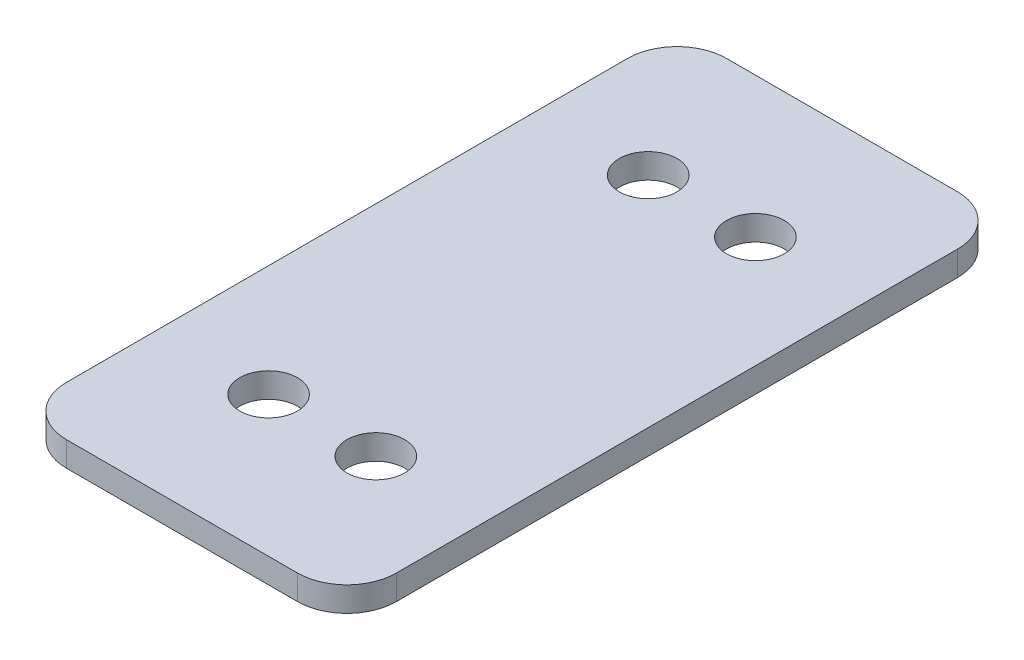
ISO-10303-21;
HEADER;
FILE_DESCRIPTION(('STEP AP214'),'2;1');
FILE_NAME('part.step','',(''),(''),'','','');
FILE_SCHEMA(('AUTOMOTIVE_DESIGN { 1 0 10303 214 1 1 1 1 }'));
ENDSEC;
DATA;
#1=APPLICATION_CONTEXT('core data for automotive mechanical design processes');
#2=APPLICATION_PROTOCOL_DEFINITION('international standard','automotive_design',2000,#1);
#3=PRODUCT_CONTEXT('',#1,'mechanical');
#4=PRODUCT('Part','Part','',(#3));
#5=PRODUCT_RELATED_PRODUCT_CATEGORY('part','',(#4));
#6=PRODUCT_DEFINITION_FORMATION('','',#4);
#7=PRODUCT_DEFINITION_CONTEXT('part definition',#1,'design');
#8=PRODUCT_DEFINITION('design','',#6,#7);
#9=PRODUCT_DEFINITION_SHAPE('','',#8);
#10=(LENGTH_UNIT() NAMED_UNIT(*) SI_UNIT(.MILLI.,.METRE.));
#11=(NAMED_UNIT(*) PLANE_ANGLE_UNIT() SI_UNIT($,.RADIAN.));
#12=(NAMED_UNIT(*) SI_UNIT($,.STERADIAN.) SOLID_ANGLE_UNIT());
#13=UNCERTAINTY_MEASURE_WITH_UNIT(LENGTH_MEASURE(1.E-05),#10,'distance_accuracy_value','');
#14=(GEOMETRIC_REPRESENTATION_CONTEXT(3) GLOBAL_UNCERTAINTY_ASSIGNED_CONTEXT((#13)) GLOBAL_UNIT_ASSIGNED_CONTEXT((#10,
#11,#12)) REPRESENTATION_CONTEXT('',''));
#15=CARTESIAN_POINT('',(0.,0.,0.));
#16=DIRECTION('',(0.,0.,1.));
#17=DIRECTION('',(1.,0.,0.));
#18=AXIS2_PLACEMENT_3D('',#15,#16,#17);
#19=CARTESIAN_POINT('',(-20.,0.,40.));
#20=DIRECTION('',(1.,0.,0.));
#21=DIRECTION('',(0.,0.,-1.));
#22=AXIS2_PLACEMENT_3D('',#19,#20,#21);
#23=PLANE('',#22);
#24=DIRECTION('',(0.,0.,-1.));
#25=VECTOR('',#24,1.);
#26=CARTESIAN_POINT('',(-20.,0.,40.));
#27=LINE('',#26,#25);
#28=CARTESIAN_POINT('',(-20.,0.,34.));
#29=VERTEX_POINT('',#28);
#30=CARTESIAN_POINT('',(-20.,0.,-34.));
#31=VERTEX_POINT('',#30);
#32=EDGE_CURVE('E121',#29,#31,#27,.T.);
#33=ORIENTED_EDGE('',*,*,#32,.T.);
#34=DIRECTION('',(0.,-1.,0.));
#35=VECTOR('',#34,1.);
#36=CARTESIAN_POINT('',(-20.,0.,-34.));
#37=LINE('',#36,#35);
#38=CARTESIAN_POINT('',(-20.,-3.,-34.));
#39=VERTEX_POINT('',#38);
#40=EDGE_CURVE('E147',#31,#39,#37,.T.);
#41=ORIENTED_EDGE('',*,*,#40,.T.);
#42=DIRECTION('',(0.,0.,-1.));
#43=VECTOR('',#42,1.);
#44=CARTESIAN_POINT('',(-20.,-3.,40.));
#45=LINE('',#44,#43);
#46=CARTESIAN_POINT('',(-20.,-3.,34.));
#47=VERTEX_POINT('',#46);
#48=EDGE_CURVE('E125',#47,#39,#45,.T.);
#49=ORIENTED_EDGE('',*,*,#48,.F.);
#50=DIRECTION('',(0.,-1.,0.));
#51=VECTOR('',#50,1.);
#52=CARTESIAN_POINT('',(-20.,0.,34.));
#53=LINE('',#52,#51);
#54=EDGE_CURVE('E145',#47,#29,#53,.F.);
#55=ORIENTED_EDGE('',*,*,#54,.T.);
#56=EDGE_LOOP('',(#33,#41,#49,#55));
#57=FACE_BOUND('',#56,.T.);
#58=ADVANCED_FACE('F33',(#57),#23,.F.);
#59=CARTESIAN_POINT('',(-20.,-3.,40.));
#60=DIRECTION('',(0.,1.,0.));
#61=DIRECTION('',(0.,0.,1.));
#62=AXIS2_PLACEMENT_3D('',#59,#60,#61);
#63=PLANE('',#62);
#64=CARTESIAN_POINT('',(-6.5,-3.,-23.));
#65=DIRECTION('',(0.,1.,0.));
#66=DIRECTION('',(0.,0.,1.));
#67=AXIS2_PLACEMENT_3D('',#64,#65,#66);
#68=CIRCLE('',#67,3.5);
#69=CARTESIAN_POINT('',(-6.5,-3.,-19.5));
#70=VERTEX_POINT('',#69);
#71=EDGE_CURVE('E160',#70,#70,#68,.T.);
#72=ORIENTED_EDGE('',*,*,#71,.T.);
#73=EDGE_LOOP('',(#72));
#74=FACE_BOUND('',#73,.T.);
#75=CARTESIAN_POINT('',(6.5,-3.,23.));
#76=DIRECTION('',(0.,1.,0.));
#77=DIRECTION('',(0.,0.,1.));
#78=AXIS2_PLACEMENT_3D('',#75,#76,#77);
#79=CIRCLE('',#78,3.5);
#80=CARTESIAN_POINT('',(6.5,-3.,26.5));
#81=VERTEX_POINT('',#80);
#82=EDGE_CURVE('E301',#81,#81,#79,.T.);
#83=ORIENTED_EDGE('',*,*,#82,.T.);
#84=EDGE_LOOP('',(#83));
#85=FACE_BOUND('',#84,.T.);
#86=CARTESIAN_POINT('',(-6.5,-3.,23.));
#87=DIRECTION('',(0.,1.,0.));
#88=DIRECTION('',(0.,0.,1.));
#89=AXIS2_PLACEMENT_3D('',#86,#87,#88);
#90=CIRCLE('',#89,3.5);
#91=CARTESIAN_POINT('',(-6.5,-3.,26.5));
#92=VERTEX_POINT('',#91);
#93=EDGE_CURVE('E303',#92,#92,#90,.T.);
#94=ORIENTED_EDGE('',*,*,#93,.T.);
#95=EDGE_LOOP('',(#94));
#96=FACE_BOUND('',#95,.T.);
#97=CARTESIAN_POINT('',(6.5,-3.,-23.));
#98=DIRECTION('',(0.,1.,0.));
#99=DIRECTION('',(0.,0.,1.));
#100=AXIS2_PLACEMENT_3D('',#97,#98,#99);
#101=CIRCLE('',#100,3.5);
#102=CARTESIAN_POINT('',(6.5,-3.,-19.5));
#103=VERTEX_POINT('',#102);
#104=EDGE_CURVE('E307',#103,#103,#101,.T.);
#105=ORIENTED_EDGE('',*,*,#104,.T.);
#106=EDGE_LOOP('',(#105));
#107=FACE_BOUND('',#106,.T.);
#108=DIRECTION('',(1.,0.,0.));
#109=VECTOR('',#108,1.);
#110=CARTESIAN_POINT('',(-20.,-3.,-40.));
#111=LINE('',#110,#109);
#112=CARTESIAN_POINT('',(-14.,-3.,-40.));
#113=VERTEX_POINT('',#112);
#114=CARTESIAN_POINT('',(14.,-3.,-40.));
#115=VERTEX_POINT('',#114);
#116=EDGE_CURVE('E157',#113,#115,#111,.T.);
#117=ORIENTED_EDGE('',*,*,#116,.T.);
#118=CARTESIAN_POINT('',(14.,-3.,-34.));
#119=DIRECTION('',(0.,1.,0.));
#120=DIRECTION('',(0.,0.,1.));
#121=AXIS2_PLACEMENT_3D('',#118,#119,#120);
#122=CIRCLE('',#121,6.);
#123=CARTESIAN_POINT('',(20.,-3.,-34.));
#124=VERTEX_POINT('',#123);
#125=EDGE_CURVE('E143',#115,#124,#122,.F.);
#126=ORIENTED_EDGE('',*,*,#125,.T.);
#127=DIRECTION('',(0.,0.,-1.));
#128=VECTOR('',#127,1.);
#129=CARTESIAN_POINT('',(20.,-3.,40.));
#130=LINE('',#129,#128);
#131=CARTESIAN_POINT('',(20.,-3.,34.));
#132=VERTEX_POINT('',#131);
#133=EDGE_CURVE('E120',#132,#124,#130,.T.);
#134=ORIENTED_EDGE('',*,*,#133,.F.);
#135=CARTESIAN_POINT('',(14.,-3.,34.));
#136=DIRECTION('',(0.,1.,0.));
#137=DIRECTION('',(0.,0.,1.));
#138=AXIS2_PLACEMENT_3D('',#135,#136,#137);
#139=CIRCLE('',#138,6.);
#140=CARTESIAN_POINT('',(14.,-3.,40.));
#141=VERTEX_POINT('',#140);
#142=EDGE_CURVE('E124',#132,#141,#139,.F.);
#143=ORIENTED_EDGE('',*,*,#142,.T.);
#144=DIRECTION('',(1.,0.,0.));
#145=VECTOR('',#144,1.);
#146=CARTESIAN_POINT('',(-20.,-3.,40.));
#147=LINE('',#146,#145);
#148=CARTESIAN_POINT('',(-14.,-3.,40.));
#149=VERTEX_POINT('',#148);
#150=EDGE_CURVE('E152',#149,#141,#147,.T.);
#151=ORIENTED_EDGE('',*,*,#150,.F.);
#152=CARTESIAN_POINT('',(-14.,-3.,34.));
#153=DIRECTION('',(0.,1.,0.));
#154=DIRECTION('',(0.,0.,1.));
#155=AXIS2_PLACEMENT_3D('',#152,#153,#154);
#156=CIRCLE('',#155,6.);
#157=EDGE_CURVE('E56',#149,#47,#156,.F.);
#158=ORIENTED_EDGE('',*,*,#157,.T.);
#159=ORIENTED_EDGE('',*,*,#48,.T.);
#160=CARTESIAN_POINT('',(-14.,-3.,-34.));
#161=DIRECTION('',(0.,1.,0.));
#162=DIRECTION('',(0.,0.,1.));
#163=AXIS2_PLACEMENT_3D('',#160,#161,#162);
#164=CIRCLE('',#163,6.);
#165=EDGE_CURVE('E48',#39,#113,#164,.F.);
#166=ORIENTED_EDGE('',*,*,#165,.T.);
#167=EDGE_LOOP('',(#117,#126,#134,#143,#151,#158,#159,#166));
#168=FACE_BOUND('',#167,.T.);
#169=ADVANCED_FACE('F190',(#74,#85,#96,#107,#168),#63,.F.);
#170=CARTESIAN_POINT('',(20.,0.,40.));
#171=DIRECTION('',(-1.,0.,0.));
#172=DIRECTION('',(0.,0.,1.));
#173=AXIS2_PLACEMENT_3D('',#170,#171,#172);
#174=PLANE('',#173);
#175=ORIENTED_EDGE('',*,*,#133,.T.);
#176=DIRECTION('',(0.,1.,0.));
#177=VECTOR('',#176,1.);
#178=CARTESIAN_POINT('',(20.,0.,-34.));
#179=LINE('',#178,#177);
#180=CARTESIAN_POINT('',(20.,0.,-34.));
#181=VERTEX_POINT('',#180);
#182=EDGE_CURVE('E111',#124,#181,#179,.T.);
#183=ORIENTED_EDGE('',*,*,#182,.T.);
#184=DIRECTION('',(0.,0.,-1.));
#185=VECTOR('',#184,1.);
#186=CARTESIAN_POINT('',(20.,0.,40.));
#187=LINE('',#186,#185);
#188=CARTESIAN_POINT('',(20.,0.,34.));
#189=VERTEX_POINT('',#188);
#190=EDGE_CURVE('E103',#189,#181,#187,.T.);
#191=ORIENTED_EDGE('',*,*,#190,.F.);
#192=DIRECTION('',(0.,1.,0.));
#193=VECTOR('',#192,1.);
#194=CARTESIAN_POINT('',(20.,-3.,34.));
#195=LINE('',#194,#193);
#196=EDGE_CURVE('E117',#189,#132,#195,.F.);
#197=ORIENTED_EDGE('',*,*,#196,.T.);
#198=EDGE_LOOP('',(#175,#183,#191,#197));
#199=FACE_BOUND('',#198,.T.);
#200=ADVANCED_FACE('F116',(#199),#174,.F.);
#201=CARTESIAN_POINT('',(-20.,0.,40.));
#202=DIRECTION('',(0.,-1.,0.));
#203=DIRECTION('',(0.,0.,-1.));
#204=AXIS2_PLACEMENT_3D('',#201,#202,#203);
#205=PLANE('',#204);
#206=CARTESIAN_POINT('',(-6.5,0.,-23.));
#207=DIRECTION('',(0.,1.,0.));
#208=DIRECTION('',(0.,0.,-1.));
#209=AXIS2_PLACEMENT_3D('',#206,#207,#208);
#210=CIRCLE('',#209,3.5);
#211=CARTESIAN_POINT('',(-6.5,0.,-26.5));
#212=VERTEX_POINT('',#211);
#213=EDGE_CURVE('E298',#212,#212,#210,.T.);
#214=ORIENTED_EDGE('',*,*,#213,.F.);
#215=EDGE_LOOP('',(#214));
#216=FACE_BOUND('',#215,.T.);
#217=CARTESIAN_POINT('',(6.5,0.,23.));
#218=DIRECTION('',(0.,1.,0.));
#219=DIRECTION('',(0.,0.,-1.));
#220=AXIS2_PLACEMENT_3D('',#217,#218,#219);
#221=CIRCLE('',#220,3.5);
#222=CARTESIAN_POINT('',(6.5,0.,19.5));
#223=VERTEX_POINT('',#222);
#224=EDGE_CURVE('E315',#223,#223,#221,.T.);
#225=ORIENTED_EDGE('',*,*,#224,.F.);
#226=EDGE_LOOP('',(#225));
#227=FACE_BOUND('',#226,.T.);
#228=CARTESIAN_POINT('',(-6.5,0.,23.));
#229=DIRECTION('',(0.,1.,0.));
#230=DIRECTION('',(0.,0.,1.));
#231=AXIS2_PLACEMENT_3D('',#228,#229,#230);
#232=CIRCLE('',#231,3.5);
#233=CARTESIAN_POINT('',(-6.5,0.,26.5));
#234=VERTEX_POINT('',#233);
#235=EDGE_CURVE('E318',#234,#234,#232,.T.);
#236=ORIENTED_EDGE('',*,*,#235,.F.);
#237=EDGE_LOOP('',(#236));
#238=FACE_BOUND('',#237,.T.);
#239=CARTESIAN_POINT('',(6.5,0.,-23.));
#240=DIRECTION('',(0.,1.,0.));
#241=DIRECTION('',(0.,0.,1.));
#242=AXIS2_PLACEMENT_3D('',#239,#240,#241);
#243=CIRCLE('',#242,3.5);
#244=CARTESIAN_POINT('',(6.5,0.,-19.5));
#245=VERTEX_POINT('',#244);
#246=EDGE_CURVE('E312',#245,#245,#243,.T.);
#247=ORIENTED_EDGE('',*,*,#246,.F.);
#248=EDGE_LOOP('',(#247));
#249=FACE_BOUND('',#248,.T.);
#250=ORIENTED_EDGE('',*,*,#190,.T.);
#251=CARTESIAN_POINT('',(14.,0.,-34.));
#252=DIRECTION('',(0.,-1.,0.));
#253=DIRECTION('',(0.,0.,-1.));
#254=AXIS2_PLACEMENT_3D('',#251,#252,#253);
#255=CIRCLE('',#254,6.);
#256=CARTESIAN_POINT('',(14.,0.,-40.));
#257=VERTEX_POINT('',#256);
#258=EDGE_CURVE('E134',#181,#257,#255,.F.);
#259=ORIENTED_EDGE('',*,*,#258,.T.);
#260=DIRECTION('',(-1.,0.,0.));
#261=VECTOR('',#260,1.);
#262=CARTESIAN_POINT('',(-20.,0.,-40.));
#263=LINE('',#262,#261);
#264=CARTESIAN_POINT('',(-14.,0.,-40.));
#265=VERTEX_POINT('',#264);
#266=EDGE_CURVE('E153',#257,#265,#263,.T.);
#267=ORIENTED_EDGE('',*,*,#266,.T.);
#268=CARTESIAN_POINT('',(-14.,0.,-34.));
#269=DIRECTION('',(0.,-1.,0.));
#270=DIRECTION('',(0.,0.,-1.));
#271=AXIS2_PLACEMENT_3D('',#268,#269,#270);
#272=CIRCLE('',#271,6.);
#273=EDGE_CURVE('E132',#265,#31,#272,.F.);
#274=ORIENTED_EDGE('',*,*,#273,.T.);
#275=ORIENTED_EDGE('',*,*,#32,.F.);
#276=CARTESIAN_POINT('',(-14.,0.,34.));
#277=DIRECTION('',(0.,-1.,0.));
#278=DIRECTION('',(0.,0.,-1.));
#279=AXIS2_PLACEMENT_3D('',#276,#277,#278);
#280=CIRCLE('',#279,6.);
#281=CARTESIAN_POINT('',(-14.,0.,40.));
#282=VERTEX_POINT('',#281);
#283=EDGE_CURVE('E110',#29,#282,#280,.F.);
#284=ORIENTED_EDGE('',*,*,#283,.T.);
#285=DIRECTION('',(-1.,0.,0.));
#286=VECTOR('',#285,1.);
#287=CARTESIAN_POINT('',(-20.,0.,40.));
#288=LINE('',#287,#286);
#289=CARTESIAN_POINT('',(14.,0.,40.));
#290=VERTEX_POINT('',#289);
#291=EDGE_CURVE('E105',#290,#282,#288,.T.);
#292=ORIENTED_EDGE('',*,*,#291,.F.);
#293=CARTESIAN_POINT('',(14.,0.,34.));
#294=DIRECTION('',(0.,-1.,0.));
#295=DIRECTION('',(0.,0.,-1.));
#296=AXIS2_PLACEMENT_3D('',#293,#294,#295);
#297=CIRCLE('',#296,6.);
#298=EDGE_CURVE('E100',#290,#189,#297,.F.);
#299=ORIENTED_EDGE('',*,*,#298,.T.);
#300=EDGE_LOOP('',(#250,#259,#267,#274,#275,#284,#292,#299));
#301=FACE_BOUND('',#300,.T.);
#302=ADVANCED_FACE('F102',(#216,#227,#238,#249,#301),#205,.F.);
#303=CARTESIAN_POINT('',(0.,0.,40.));
#304=DIRECTION('',(0.,0.,1.));
#305=DIRECTION('',(1.,0.,0.));
#306=AXIS2_PLACEMENT_3D('',#303,#304,#305);
#307=PLANE('',#306);
#308=ORIENTED_EDGE('',*,*,#291,.T.);
#309=DIRECTION('',(0.,-1.,0.));
#310=VECTOR('',#309,1.);
#311=CARTESIAN_POINT('',(-14.,-3.,40.));
#312=LINE('',#311,#310);
#313=EDGE_CURVE('E11',#282,#149,#312,.T.);
#314=ORIENTED_EDGE('',*,*,#313,.T.);
#315=ORIENTED_EDGE('',*,*,#150,.T.);
#316=DIRECTION('',(0.,1.,0.));
#317=VECTOR('',#316,1.);
#318=CARTESIAN_POINT('',(14.,0.,40.));
#319=LINE('',#318,#317);
#320=EDGE_CURVE('E41',#141,#290,#319,.T.);
#321=ORIENTED_EDGE('',*,*,#320,.T.);
#322=EDGE_LOOP('',(#308,#314,#315,#321));
#323=FACE_BOUND('',#322,.T.);
#324=ADVANCED_FACE('F150',(#323),#307,.T.);
#325=CARTESIAN_POINT('',(0.,0.,-40.));
#326=DIRECTION('',(0.,0.,1.));
#327=DIRECTION('',(1.,0.,0.));
#328=AXIS2_PLACEMENT_3D('',#325,#326,#327);
#329=PLANE('',#328);
#330=ORIENTED_EDGE('',*,*,#266,.F.);
#331=DIRECTION('',(0.,1.,0.));
#332=VECTOR('',#331,1.);
#333=CARTESIAN_POINT('',(14.,0.,-40.));
#334=LINE('',#333,#332);
#335=EDGE_CURVE('E138',#257,#115,#334,.F.);
#336=ORIENTED_EDGE('',*,*,#335,.T.);
#337=ORIENTED_EDGE('',*,*,#116,.F.);
#338=DIRECTION('',(0.,-1.,0.));
#339=VECTOR('',#338,1.);
#340=CARTESIAN_POINT('',(-14.,0.,-40.));
#341=LINE('',#340,#339);
#342=EDGE_CURVE('E136',#113,#265,#341,.F.);
#343=ORIENTED_EDGE('',*,*,#342,.T.);
#344=EDGE_LOOP('',(#330,#336,#337,#343));
#345=FACE_BOUND('',#344,.T.);
#346=ADVANCED_FACE('F173',(#345),#329,.F.);
#347=CARTESIAN_POINT('',(14.,0.,-34.));
#348=DIRECTION('',(0.,1.,0.));
#349=DIRECTION('',(0.,0.,1.));
#350=AXIS2_PLACEMENT_3D('',#347,#348,#349);
#351=CYLINDRICAL_SURFACE('',#350,6.);
#352=ORIENTED_EDGE('',*,*,#125,.F.);
#353=ORIENTED_EDGE('',*,*,#335,.F.);
#354=ORIENTED_EDGE('',*,*,#258,.F.);
#355=ORIENTED_EDGE('',*,*,#182,.F.);
#356=EDGE_LOOP('',(#352,#353,#354,#355));
#357=FACE_BOUND('',#356,.T.);
#358=ADVANCED_FACE('F168',(#357),#351,.T.);
#359=CARTESIAN_POINT('',(-14.,0.,-34.));
#360=DIRECTION('',(0.,-1.,0.));
#361=DIRECTION('',(0.,0.,-1.));
#362=AXIS2_PLACEMENT_3D('',#359,#360,#361);
#363=CYLINDRICAL_SURFACE('',#362,6.);
#364=ORIENTED_EDGE('',*,*,#273,.F.);
#365=ORIENTED_EDGE('',*,*,#342,.F.);
#366=ORIENTED_EDGE('',*,*,#165,.F.);
#367=ORIENTED_EDGE('',*,*,#40,.F.);
#368=EDGE_LOOP('',(#364,#365,#366,#367));
#369=FACE_BOUND('',#368,.T.);
#370=ADVANCED_FACE('F175',(#369),#363,.T.);
#371=CARTESIAN_POINT('',(-14.,0.,34.));
#372=DIRECTION('',(0.,1.,0.));
#373=DIRECTION('',(0.,0.,1.));
#374=AXIS2_PLACEMENT_3D('',#371,#372,#373);
#375=CYLINDRICAL_SURFACE('',#374,6.);
#376=ORIENTED_EDGE('',*,*,#283,.F.);
#377=ORIENTED_EDGE('',*,*,#54,.F.);
#378=ORIENTED_EDGE('',*,*,#157,.F.);
#379=ORIENTED_EDGE('',*,*,#313,.F.);
#380=EDGE_LOOP('',(#376,#377,#378,#379));
#381=FACE_BOUND('',#380,.T.);
#382=ADVANCED_FACE('F181',(#381),#375,.T.);
#383=CARTESIAN_POINT('',(14.,0.,34.));
#384=DIRECTION('',(0.,-1.,0.));
#385=DIRECTION('',(0.,0.,-1.));
#386=AXIS2_PLACEMENT_3D('',#383,#384,#385);
#387=CYLINDRICAL_SURFACE('',#386,6.);
#388=ORIENTED_EDGE('',*,*,#142,.F.);
#389=ORIENTED_EDGE('',*,*,#196,.F.);
#390=ORIENTED_EDGE('',*,*,#298,.F.);
#391=ORIENTED_EDGE('',*,*,#320,.F.);
#392=EDGE_LOOP('',(#388,#389,#390,#391));
#393=FACE_BOUND('',#392,.T.);
#394=ADVANCED_FACE('F35',(#393),#387,.T.);
#395=CARTESIAN_POINT('',(6.5,-10.,-23.));
#396=DIRECTION('',(0.,1.,0.));
#397=DIRECTION('',(0.,0.,1.));
#398=AXIS2_PLACEMENT_3D('',#395,#396,#397);
#399=CYLINDRICAL_SURFACE('',#398,3.5);
#400=ORIENTED_EDGE('',*,*,#246,.T.);
#401=EDGE_LOOP('',(#400));
#402=FACE_BOUND('',#401,.T.);
#403=ORIENTED_EDGE('',*,*,#104,.F.);
#404=EDGE_LOOP('',(#403));
#405=FACE_BOUND('',#404,.T.);
#406=ADVANCED_FACE('F187',(#402,#405),#399,.F.);
#407=CARTESIAN_POINT('',(-6.5,-10.,23.));
#408=DIRECTION('',(0.,1.,0.));
#409=DIRECTION('',(0.,0.,1.));
#410=AXIS2_PLACEMENT_3D('',#407,#408,#409);
#411=CYLINDRICAL_SURFACE('',#410,3.5);
#412=ORIENTED_EDGE('',*,*,#235,.T.);
#413=EDGE_LOOP('',(#412));
#414=FACE_BOUND('',#413,.T.);
#415=ORIENTED_EDGE('',*,*,#93,.F.);
#416=EDGE_LOOP('',(#415));
#417=FACE_BOUND('',#416,.T.);
#418=ADVANCED_FACE('F262',(#414,#417),#411,.F.);
#419=CARTESIAN_POINT('',(6.5,-10.,23.));
#420=DIRECTION('',(0.,1.,0.));
#421=DIRECTION('',(0.,0.,1.));
#422=AXIS2_PLACEMENT_3D('',#419,#420,#421);
#423=CYLINDRICAL_SURFACE('',#422,3.5);
#424=ORIENTED_EDGE('',*,*,#224,.T.);
#425=EDGE_LOOP('',(#424));
#426=FACE_BOUND('',#425,.T.);
#427=ORIENTED_EDGE('',*,*,#82,.F.);
#428=EDGE_LOOP('',(#427));
#429=FACE_BOUND('',#428,.T.);
#430=ADVANCED_FACE('F268',(#426,#429),#423,.F.);
#431=CARTESIAN_POINT('',(-6.5,-10.,-23.));
#432=DIRECTION('',(0.,1.,0.));
#433=DIRECTION('',(0.,0.,1.));
#434=AXIS2_PLACEMENT_3D('',#431,#432,#433);
#435=CYLINDRICAL_SURFACE('',#434,3.5);
#436=ORIENTED_EDGE('',*,*,#213,.T.);
#437=EDGE_LOOP('',(#436));
#438=FACE_BOUND('',#437,.T.);
#439=ORIENTED_EDGE('',*,*,#71,.F.);
#440=EDGE_LOOP('',(#439));
#441=FACE_BOUND('',#440,.T.);
#442=ADVANCED_FACE('F276',(#438,#441),#435,.F.);
#443=CLOSED_SHELL('',(#58,#169,#200,#302,#324,#346,#358,#370,#382,#394,#406,#418,#430,#442));
#444=MANIFOLD_SOLID_BREP('B2',#443);
#445=ADVANCED_BREP_SHAPE_REPRESENTATION('',(#18,#444),#14);
#446=SHAPE_DEFINITION_REPRESENTATION(#9,#445);
ENDSEC;
END-ISO-10303-21;
